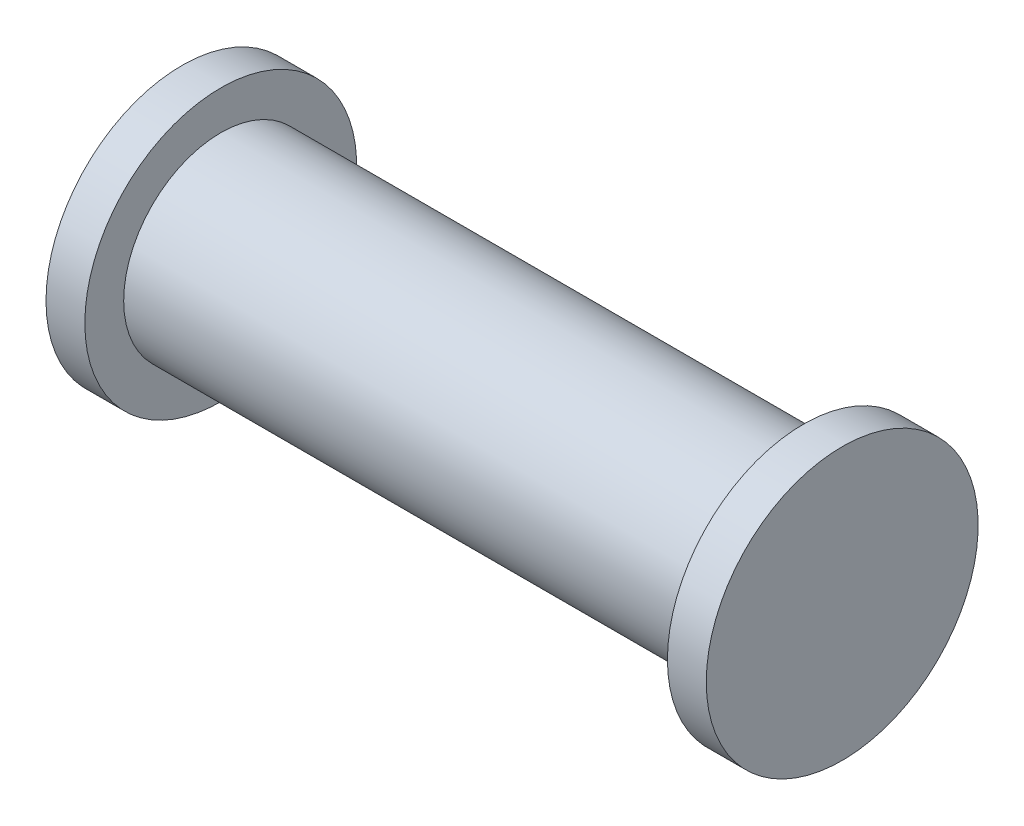
ISO-10303-21;
HEADER;
FILE_DESCRIPTION(('STEP AP214'),'2;1');
FILE_NAME('part.step','',(''),(''),'','','');
FILE_SCHEMA(('AUTOMOTIVE_DESIGN { 1 0 10303 214 1 1 1 1 }'));
ENDSEC;
DATA;
#1=APPLICATION_CONTEXT('core data for automotive mechanical design processes');
#2=APPLICATION_PROTOCOL_DEFINITION('international standard','automotive_design',2000,#1);
#3=PRODUCT_CONTEXT('',#1,'mechanical');
#4=PRODUCT('Part','Part','',(#3));
#5=PRODUCT_RELATED_PRODUCT_CATEGORY('part','',(#4));
#6=PRODUCT_DEFINITION_FORMATION('','',#4);
#7=PRODUCT_DEFINITION_CONTEXT('part definition',#1,'design');
#8=PRODUCT_DEFINITION('design','',#6,#7);
#9=PRODUCT_DEFINITION_SHAPE('','',#8);
#10=(LENGTH_UNIT() NAMED_UNIT(*) SI_UNIT(.MILLI.,.METRE.));
#11=(NAMED_UNIT(*) PLANE_ANGLE_UNIT() SI_UNIT($,.RADIAN.));
#12=(NAMED_UNIT(*) SI_UNIT($,.STERADIAN.) SOLID_ANGLE_UNIT());
#13=UNCERTAINTY_MEASURE_WITH_UNIT(LENGTH_MEASURE(1.E-05),#10,'distance_accuracy_value','');
#14=(GEOMETRIC_REPRESENTATION_CONTEXT(3) GLOBAL_UNCERTAINTY_ASSIGNED_CONTEXT((#13)) GLOBAL_UNIT_ASSIGNED_CONTEXT((#10,
#11,#12)) REPRESENTATION_CONTEXT('',''));
#15=CARTESIAN_POINT('',(0.,0.,0.));
#16=DIRECTION('',(0.,0.,1.));
#17=DIRECTION('',(1.,0.,0.));
#18=AXIS2_PLACEMENT_3D('',#15,#16,#17);
#19=CARTESIAN_POINT('',(15.,7.,0.));
#20=DIRECTION('',(1.,0.,0.));
#21=DIRECTION('',(0.,0.,-1.));
#22=AXIS2_PLACEMENT_3D('',#19,#20,#21);
#23=PLANE('',#22);
#24=CARTESIAN_POINT('',(15.,0.,0.));
#25=DIRECTION('',(-1.,0.,0.));
#26=DIRECTION('',(0.,0.,1.));
#27=AXIS2_PLACEMENT_3D('',#24,#25,#26);
#28=CIRCLE('',#27,5.00000000000001);
#29=CARTESIAN_POINT('',(15.,0.,5.00000000000001));
#30=VERTEX_POINT('',#29);
#31=EDGE_CURVE('E10',#30,#30,#28,.T.);
#32=ORIENTED_EDGE('',*,*,#31,.F.);
#33=EDGE_LOOP('',(#32));
#34=FACE_BOUND('',#33,.T.);
#35=CARTESIAN_POINT('',(15.,0.,0.));
#36=DIRECTION('',(-1.,0.,0.));
#37=DIRECTION('',(0.,0.,1.));
#38=AXIS2_PLACEMENT_3D('',#35,#36,#37);
#39=CIRCLE('',#38,7.);
#40=CARTESIAN_POINT('',(15.,0.,7.));
#41=VERTEX_POINT('',#40);
#42=EDGE_CURVE('E50',#41,#41,#39,.T.);
#43=ORIENTED_EDGE('',*,*,#42,.T.);
#44=EDGE_LOOP('',(#43));
#45=FACE_BOUND('',#44,.T.);
#46=ADVANCED_FACE('F28',(#34,#45),#23,.F.);
#47=CARTESIAN_POINT('',(-17.,0.,0.));
#48=DIRECTION('',(-1.,0.,0.));
#49=DIRECTION('',(0.,0.,1.));
#50=AXIS2_PLACEMENT_3D('',#47,#48,#49);
#51=CYLINDRICAL_SURFACE('',#50,5.);
#52=CARTESIAN_POINT('',(-15.,0.,0.));
#53=DIRECTION('',(-1.,0.,0.));
#54=DIRECTION('',(0.,0.,1.));
#55=AXIS2_PLACEMENT_3D('',#52,#53,#54);
#56=CIRCLE('',#55,5.);
#57=CARTESIAN_POINT('',(-15.,0.,5.));
#58=VERTEX_POINT('',#57);
#59=EDGE_CURVE('E34',#58,#58,#56,.T.);
#60=ORIENTED_EDGE('',*,*,#59,.F.);
#61=EDGE_LOOP('',(#60));
#62=FACE_BOUND('',#61,.T.);
#63=ORIENTED_EDGE('',*,*,#31,.T.);
#64=EDGE_LOOP('',(#63));
#65=FACE_BOUND('',#64,.T.);
#66=ADVANCED_FACE('F72',(#62,#65),#51,.T.);
#67=CARTESIAN_POINT('',(-15.,5.,0.));
#68=DIRECTION('',(-1.,0.,0.));
#69=DIRECTION('',(0.,0.,1.));
#70=AXIS2_PLACEMENT_3D('',#67,#68,#69);
#71=PLANE('',#70);
#72=CARTESIAN_POINT('',(-15.,0.,0.));
#73=DIRECTION('',(-1.,0.,0.));
#74=DIRECTION('',(0.,0.,1.));
#75=AXIS2_PLACEMENT_3D('',#72,#73,#74);
#76=CIRCLE('',#75,7.);
#77=CARTESIAN_POINT('',(-15.,0.,7.));
#78=VERTEX_POINT('',#77);
#79=EDGE_CURVE('E38',#78,#78,#76,.T.);
#80=ORIENTED_EDGE('',*,*,#79,.F.);
#81=EDGE_LOOP('',(#80));
#82=FACE_BOUND('',#81,.T.);
#83=ORIENTED_EDGE('',*,*,#59,.T.);
#84=EDGE_LOOP('',(#83));
#85=FACE_BOUND('',#84,.T.);
#86=ADVANCED_FACE('F77',(#82,#85),#71,.F.);
#87=CARTESIAN_POINT('',(-17.,0.,0.));
#88=DIRECTION('',(-1.,0.,0.));
#89=DIRECTION('',(0.,0.,1.));
#90=AXIS2_PLACEMENT_3D('',#87,#88,#89);
#91=CYLINDRICAL_SURFACE('',#90,7.);
#92=CARTESIAN_POINT('',(-17.,0.,0.));
#93=DIRECTION('',(-1.,0.,0.));
#94=DIRECTION('',(0.,0.,1.));
#95=AXIS2_PLACEMENT_3D('',#92,#93,#94);
#96=CIRCLE('',#95,7.);
#97=CARTESIAN_POINT('',(-17.,0.,7.));
#98=VERTEX_POINT('',#97);
#99=EDGE_CURVE('E42',#98,#98,#96,.T.);
#100=ORIENTED_EDGE('',*,*,#99,.F.);
#101=EDGE_LOOP('',(#100));
#102=FACE_BOUND('',#101,.T.);
#103=ORIENTED_EDGE('',*,*,#79,.T.);
#104=EDGE_LOOP('',(#103));
#105=FACE_BOUND('',#104,.T.);
#106=ADVANCED_FACE('F68',(#102,#105),#91,.T.);
#107=CARTESIAN_POINT('',(-17.,7.,0.));
#108=DIRECTION('',(1.,0.,0.));
#109=DIRECTION('',(0.,0.,-1.));
#110=AXIS2_PLACEMENT_3D('',#107,#108,#109);
#111=PLANE('',#110);
#112=ORIENTED_EDGE('',*,*,#99,.T.);
#113=EDGE_LOOP('',(#112));
#114=FACE_BOUND('',#113,.T.);
#115=ADVANCED_FACE('F63',(#114),#111,.F.);
#116=CARTESIAN_POINT('',(17.,0.,0.));
#117=DIRECTION('',(-1.,0.,0.));
#118=DIRECTION('',(0.,0.,1.));
#119=AXIS2_PLACEMENT_3D('',#116,#117,#118);
#120=PLANE('',#119);
#121=CARTESIAN_POINT('',(17.,0.,0.));
#122=DIRECTION('',(-1.,0.,0.));
#123=DIRECTION('',(0.,0.,1.));
#124=AXIS2_PLACEMENT_3D('',#121,#122,#123);
#125=CIRCLE('',#124,7.);
#126=CARTESIAN_POINT('',(17.,0.,7.));
#127=VERTEX_POINT('',#126);
#128=EDGE_CURVE('E47',#127,#127,#125,.T.);
#129=ORIENTED_EDGE('',*,*,#128,.F.);
#130=EDGE_LOOP('',(#129));
#131=FACE_BOUND('',#130,.T.);
#132=ADVANCED_FACE('F58',(#131),#120,.F.);
#133=CARTESIAN_POINT('',(-17.,0.,0.));
#134=DIRECTION('',(-1.,0.,0.));
#135=DIRECTION('',(0.,0.,1.));
#136=AXIS2_PLACEMENT_3D('',#133,#134,#135);
#137=CYLINDRICAL_SURFACE('',#136,7.);
#138=ORIENTED_EDGE('',*,*,#42,.F.);
#139=EDGE_LOOP('',(#138));
#140=FACE_BOUND('',#139,.T.);
#141=ORIENTED_EDGE('',*,*,#128,.T.);
#142=EDGE_LOOP('',(#141));
#143=FACE_BOUND('',#142,.T.);
#144=ADVANCED_FACE('F55',(#140,#143),#137,.T.);
#145=CLOSED_SHELL('',(#46,#66,#86,#106,#115,#132,#144));
#146=MANIFOLD_SOLID_BREP('B2',#145);
#147=ADVANCED_BREP_SHAPE_REPRESENTATION('',(#18,#146),#14);
#148=SHAPE_DEFINITION_REPRESENTATION(#9,#147);
ENDSEC;
END-ISO-10303-21;
